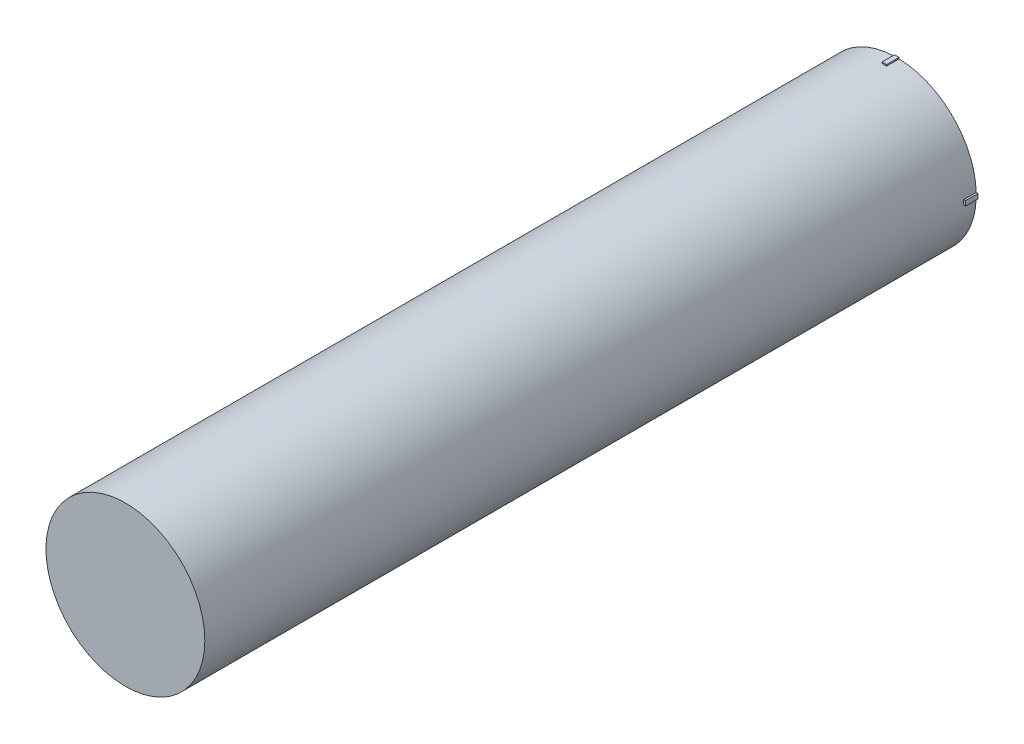
ISO-10303-21;
HEADER;
FILE_DESCRIPTION(('STEP AP214'),'2;1');
FILE_NAME('part.step','',(''),(''),'','','');
FILE_SCHEMA(('AUTOMOTIVE_DESIGN { 1 0 10303 214 1 1 1 1 }'));
ENDSEC;
DATA;
#1=APPLICATION_CONTEXT('core data for automotive mechanical design processes');
#2=APPLICATION_PROTOCOL_DEFINITION('international standard','automotive_design',2000,#1);
#3=PRODUCT_CONTEXT('',#1,'mechanical');
#4=PRODUCT('Part','Part','',(#3));
#5=PRODUCT_RELATED_PRODUCT_CATEGORY('part','',(#4));
#6=PRODUCT_DEFINITION_FORMATION('','',#4);
#7=PRODUCT_DEFINITION_CONTEXT('part definition',#1,'design');
#8=PRODUCT_DEFINITION('design','',#6,#7);
#9=PRODUCT_DEFINITION_SHAPE('','',#8);
#10=(LENGTH_UNIT() NAMED_UNIT(*) SI_UNIT(.MILLI.,.METRE.));
#11=(NAMED_UNIT(*) PLANE_ANGLE_UNIT() SI_UNIT($,.RADIAN.));
#12=(NAMED_UNIT(*) SI_UNIT($,.STERADIAN.) SOLID_ANGLE_UNIT());
#13=UNCERTAINTY_MEASURE_WITH_UNIT(LENGTH_MEASURE(1.E-05),#10,'distance_accuracy_value','');
#14=(GEOMETRIC_REPRESENTATION_CONTEXT(3) GLOBAL_UNCERTAINTY_ASSIGNED_CONTEXT((#13)) GLOBAL_UNIT_ASSIGNED_CONTEXT((#10,
#11,#12)) REPRESENTATION_CONTEXT('',''));
#15=CARTESIAN_POINT('',(0.,0.,0.));
#16=DIRECTION('',(0.,0.,1.));
#17=DIRECTION('',(1.,0.,0.));
#18=AXIS2_PLACEMENT_3D('',#15,#16,#17);
#19=CARTESIAN_POINT('',(0.,0.,185.));
#20=DIRECTION('',(0.,0.,-1.));
#21=DIRECTION('',(-1.,0.,0.));
#22=AXIS2_PLACEMENT_3D('',#19,#20,#21);
#23=CYLINDRICAL_SURFACE('',#22,19.05);
#24=CARTESIAN_POINT('',(0.,0.,0.));
#25=DIRECTION('',(0.,0.,1.));
#26=DIRECTION('',(1.,0.,0.));
#27=AXIS2_PLACEMENT_3D('',#24,#25,#26);
#28=CIRCLE('',#27,19.05);
#29=CARTESIAN_POINT('',(-19.0416827581294,-0.562865648940678,0.));
#30=VERTEX_POINT('',#29);
#31=CARTESIAN_POINT('',(-0.545809114124121,-19.0421792978361,0.));
#32=VERTEX_POINT('',#31);
#33=EDGE_CURVE('E262',#30,#32,#28,.T.);
#34=ORIENTED_EDGE('',*,*,#33,.T.);
#35=DIRECTION('',(0.,0.,-1.));
#36=VECTOR('',#35,1.);
#37=CARTESIAN_POINT('',(-0.545809114124121,-19.0421792978361,185.));
#38=LINE('',#37,#36);
#39=CARTESIAN_POINT('',(-0.545809114124121,-19.0421792978361,3.));
#40=VERTEX_POINT('',#39);
#41=EDGE_CURVE('E50',#32,#40,#38,.F.);
#42=ORIENTED_EDGE('',*,*,#41,.T.);
#43=CARTESIAN_POINT('',(0.,0.,3.));
#44=DIRECTION('',(0.,0.,1.));
#45=DIRECTION('',(1.,0.,0.));
#46=AXIS2_PLACEMENT_3D('',#43,#44,#45);
#47=CIRCLE('',#46,19.05);
#48=CARTESIAN_POINT('',(0.545809114124121,-19.0421792978361,3.));
#49=VERTEX_POINT('',#48);
#50=EDGE_CURVE('E11',#40,#49,#47,.T.);
#51=ORIENTED_EDGE('',*,*,#50,.T.);
#52=DIRECTION('',(0.,0.,-1.));
#53=VECTOR('',#52,1.);
#54=CARTESIAN_POINT('',(0.545809114124121,-19.0421792978361,185.));
#55=LINE('',#54,#53);
#56=CARTESIAN_POINT('',(0.545809114124121,-19.0421792978361,0.));
#57=VERTEX_POINT('',#56);
#58=EDGE_CURVE('E148',#49,#57,#55,.T.);
#59=ORIENTED_EDGE('',*,*,#58,.T.);
#60=CARTESIAN_POINT('',(19.0416827581294,-0.562865648940678,0.));
#61=VERTEX_POINT('',#60);
#62=EDGE_CURVE('E254',#57,#61,#28,.T.);
#63=ORIENTED_EDGE('',*,*,#62,.T.);
#64=DIRECTION('',(0.,0.,-1.));
#65=VECTOR('',#64,1.);
#66=CARTESIAN_POINT('',(19.0416827581294,-0.562865648940678,185.));
#67=LINE('',#66,#65);
#68=CARTESIAN_POINT('',(19.0416827581294,-0.562865648940678,3.));
#69=VERTEX_POINT('',#68);
#70=EDGE_CURVE('E252',#61,#69,#67,.F.);
#71=ORIENTED_EDGE('',*,*,#70,.T.);
#72=CARTESIAN_POINT('',(0.,0.,3.));
#73=DIRECTION('',(0.,0.,1.));
#74=DIRECTION('',(1.,0.,0.));
#75=AXIS2_PLACEMENT_3D('',#72,#73,#74);
#76=CIRCLE('',#75,19.05);
#77=CARTESIAN_POINT('',(19.0416827581294,0.562865648940678,3.));
#78=VERTEX_POINT('',#77);
#79=EDGE_CURVE('E258',#69,#78,#76,.T.);
#80=ORIENTED_EDGE('',*,*,#79,.T.);
#81=DIRECTION('',(0.,0.,-1.));
#82=VECTOR('',#81,1.);
#83=CARTESIAN_POINT('',(19.0416827581294,0.562865648940678,185.));
#84=LINE('',#83,#82);
#85=CARTESIAN_POINT('',(19.0416827581294,0.562865648940678,0.));
#86=VERTEX_POINT('',#85);
#87=EDGE_CURVE('E247',#78,#86,#84,.T.);
#88=ORIENTED_EDGE('',*,*,#87,.T.);
#89=CARTESIAN_POINT('',(0.545809114124121,19.0421792978361,0.));
#90=VERTEX_POINT('',#89);
#91=EDGE_CURVE('E259',#86,#90,#28,.T.);
#92=ORIENTED_EDGE('',*,*,#91,.T.);
#93=DIRECTION('',(0.,0.,-1.));
#94=VECTOR('',#93,1.);
#95=CARTESIAN_POINT('',(0.545809114124121,19.0421792978361,185.));
#96=LINE('',#95,#94);
#97=CARTESIAN_POINT('',(0.545809114124121,19.0421792978361,3.));
#98=VERTEX_POINT('',#97);
#99=EDGE_CURVE('E195',#90,#98,#96,.F.);
#100=ORIENTED_EDGE('',*,*,#99,.T.);
#101=CARTESIAN_POINT('',(0.,0.,3.));
#102=DIRECTION('',(0.,0.,1.));
#103=DIRECTION('',(1.,0.,0.));
#104=AXIS2_PLACEMENT_3D('',#101,#102,#103);
#105=CIRCLE('',#104,19.05);
#106=CARTESIAN_POINT('',(-0.545809114124121,19.0421792978361,3.));
#107=VERTEX_POINT('',#106);
#108=EDGE_CURVE('E40',#98,#107,#105,.T.);
#109=ORIENTED_EDGE('',*,*,#108,.T.);
#110=DIRECTION('',(0.,0.,-1.));
#111=VECTOR('',#110,1.);
#112=CARTESIAN_POINT('',(-0.545809114124121,19.0421792978361,185.));
#113=LINE('',#112,#111);
#114=CARTESIAN_POINT('',(-0.545809114124121,19.0421792978361,0.));
#115=VERTEX_POINT('',#114);
#116=EDGE_CURVE('E199',#107,#115,#113,.T.);
#117=ORIENTED_EDGE('',*,*,#116,.T.);
#118=CARTESIAN_POINT('',(-19.0416827581294,0.562865648940678,0.));
#119=VERTEX_POINT('',#118);
#120=EDGE_CURVE('E261',#115,#119,#28,.T.);
#121=ORIENTED_EDGE('',*,*,#120,.T.);
#122=DIRECTION('',(0.,0.,-1.));
#123=VECTOR('',#122,1.);
#124=CARTESIAN_POINT('',(-19.0416827581294,0.562865648940678,185.));
#125=LINE('',#124,#123);
#126=CARTESIAN_POINT('',(-19.0416827581294,0.562865648940678,3.));
#127=VERTEX_POINT('',#126);
#128=EDGE_CURVE('E226',#119,#127,#125,.F.);
#129=ORIENTED_EDGE('',*,*,#128,.T.);
#130=CARTESIAN_POINT('',(0.,0.,3.));
#131=DIRECTION('',(0.,0.,-1.));
#132=DIRECTION('',(-1.,0.,0.));
#133=AXIS2_PLACEMENT_3D('',#130,#131,#132);
#134=CIRCLE('',#133,19.05);
#135=CARTESIAN_POINT('',(-19.0416827581294,-0.562865648940677,3.));
#136=VERTEX_POINT('',#135);
#137=EDGE_CURVE('E264',#136,#127,#134,.T.);
#138=ORIENTED_EDGE('',*,*,#137,.F.);
#139=DIRECTION('',(0.,0.,-1.));
#140=VECTOR('',#139,1.);
#141=CARTESIAN_POINT('',(-19.0416827581294,-0.562865648940677,185.));
#142=LINE('',#141,#140);
#143=EDGE_CURVE('E221',#136,#30,#142,.T.);
#144=ORIENTED_EDGE('',*,*,#143,.T.);
#145=EDGE_LOOP('',(#34,#42,#51,#59,#63,#71,#80,#88,#92,#100,#109,#117,#121,#129,#138,#144));
#146=FACE_BOUND('',#145,.T.);
#147=CARTESIAN_POINT('',(0.,0.,185.));
#148=DIRECTION('',(0.,0.,1.));
#149=DIRECTION('',(1.,0.,0.));
#150=AXIS2_PLACEMENT_3D('',#147,#148,#149);
#151=CIRCLE('',#150,19.05);
#152=CARTESIAN_POINT('',(19.05,0.,185.));
#153=VERTEX_POINT('',#152);
#154=EDGE_CURVE('E255',#153,#153,#151,.T.);
#155=ORIENTED_EDGE('',*,*,#154,.F.);
#156=EDGE_LOOP('',(#155));
#157=FACE_BOUND('',#156,.T.);
#158=ADVANCED_FACE('F33',(#146,#157),#23,.T.);
#159=CARTESIAN_POINT('',(0.,0.,185.));
#160=DIRECTION('',(0.,0.,1.));
#161=DIRECTION('',(1.,0.,0.));
#162=AXIS2_PLACEMENT_3D('',#159,#160,#161);
#163=PLANE('',#162);
#164=ORIENTED_EDGE('',*,*,#154,.T.);
#165=EDGE_LOOP('',(#164));
#166=FACE_BOUND('',#165,.T.);
#167=ADVANCED_FACE('F315',(#166),#163,.T.);
#168=CARTESIAN_POINT('',(0.,0.,0.));
#169=DIRECTION('',(0.,0.,1.));
#170=DIRECTION('',(1.,0.,0.));
#171=AXIS2_PLACEMENT_3D('',#168,#169,#170);
#172=PLANE('',#171);
#173=ORIENTED_EDGE('',*,*,#62,.F.);
#174=DIRECTION('',(0.,-1.,0.));
#175=VECTOR('',#174,1.);
#176=CARTESIAN_POINT('',(0.545809114124121,-19.3840122581255,0.));
#177=LINE('',#176,#175);
#178=CARTESIAN_POINT('',(0.545809114124121,-19.3840122581255,0.));
#179=VERTEX_POINT('',#178);
#180=EDGE_CURVE('E170',#57,#179,#177,.T.);
#181=ORIENTED_EDGE('',*,*,#180,.T.);
#182=DIRECTION('',(-1.,0.,0.));
#183=VECTOR('',#182,1.);
#184=CARTESIAN_POINT('',(0.545809114124121,-19.3840122581255,0.));
#185=LINE('',#184,#183);
#186=CARTESIAN_POINT('',(-0.545809114124121,-19.3840122581255,0.));
#187=VERTEX_POINT('',#186);
#188=EDGE_CURVE('E158',#179,#187,#185,.T.);
#189=ORIENTED_EDGE('',*,*,#188,.T.);
#190=DIRECTION('',(0.,1.,0.));
#191=VECTOR('',#190,1.);
#192=CARTESIAN_POINT('',(-0.545809114124121,-19.3840122581255,0.));
#193=LINE('',#192,#191);
#194=EDGE_CURVE('E167',#187,#32,#193,.T.);
#195=ORIENTED_EDGE('',*,*,#194,.T.);
#196=ORIENTED_EDGE('',*,*,#33,.F.);
#197=DIRECTION('',(-1.,0.,0.));
#198=VECTOR('',#197,1.);
#199=CARTESIAN_POINT('',(-19.4351818625744,-0.562865648940677,0.));
#200=LINE('',#199,#198);
#201=CARTESIAN_POINT('',(-19.4351818625744,-0.562865648940677,0.));
#202=VERTEX_POINT('',#201);
#203=EDGE_CURVE('E202',#30,#202,#200,.T.);
#204=ORIENTED_EDGE('',*,*,#203,.T.);
#205=DIRECTION('',(0.,1.,0.));
#206=VECTOR('',#205,1.);
#207=CARTESIAN_POINT('',(-19.4351818625744,-0.562865648940677,0.));
#208=LINE('',#207,#206);
#209=CARTESIAN_POINT('',(-19.4351818625744,0.562865648940678,0.));
#210=VERTEX_POINT('',#209);
#211=EDGE_CURVE('E214',#202,#210,#208,.T.);
#212=ORIENTED_EDGE('',*,*,#211,.T.);
#213=DIRECTION('',(1.,0.,0.));
#214=VECTOR('',#213,1.);
#215=CARTESIAN_POINT('',(-19.4351818625744,0.562865648940678,0.));
#216=LINE('',#215,#214);
#217=EDGE_CURVE('E206',#210,#119,#216,.T.);
#218=ORIENTED_EDGE('',*,*,#217,.T.);
#219=ORIENTED_EDGE('',*,*,#120,.F.);
#220=DIRECTION('',(0.,1.,0.));
#221=VECTOR('',#220,1.);
#222=CARTESIAN_POINT('',(-0.545809114124121,18.7358639351027,0.));
#223=LINE('',#222,#221);
#224=CARTESIAN_POINT('',(-0.545809114124121,19.3641360648973,0.));
#225=VERTEX_POINT('',#224);
#226=EDGE_CURVE('E176',#115,#225,#223,.T.);
#227=ORIENTED_EDGE('',*,*,#226,.T.);
#228=DIRECTION('',(1.,0.,0.));
#229=VECTOR('',#228,1.);
#230=CARTESIAN_POINT('',(0.545809114124121,19.3641360648973,0.));
#231=LINE('',#230,#229);
#232=CARTESIAN_POINT('',(0.545809114124121,19.3641360648973,0.));
#233=VERTEX_POINT('',#232);
#234=EDGE_CURVE('E188',#225,#233,#231,.T.);
#235=ORIENTED_EDGE('',*,*,#234,.T.);
#236=DIRECTION('',(0.,-1.,0.));
#237=VECTOR('',#236,1.);
#238=CARTESIAN_POINT('',(0.545809114124121,18.7358639351027,0.));
#239=LINE('',#238,#237);
#240=EDGE_CURVE('E180',#233,#90,#239,.T.);
#241=ORIENTED_EDGE('',*,*,#240,.T.);
#242=ORIENTED_EDGE('',*,*,#91,.F.);
#243=DIRECTION('',(1.,0.,0.));
#244=VECTOR('',#243,1.);
#245=CARTESIAN_POINT('',(19.4692949322072,0.562865648940678,0.));
#246=LINE('',#245,#244);
#247=CARTESIAN_POINT('',(19.4692949322072,0.562865648940678,0.));
#248=VERTEX_POINT('',#247);
#249=EDGE_CURVE('E228',#86,#248,#246,.T.);
#250=ORIENTED_EDGE('',*,*,#249,.T.);
#251=DIRECTION('',(0.,-1.,0.));
#252=VECTOR('',#251,1.);
#253=CARTESIAN_POINT('',(19.4692949322072,-0.562865648940678,0.));
#254=LINE('',#253,#252);
#255=CARTESIAN_POINT('',(19.4692949322072,-0.562865648940678,0.));
#256=VERTEX_POINT('',#255);
#257=EDGE_CURVE('E240',#248,#256,#254,.T.);
#258=ORIENTED_EDGE('',*,*,#257,.T.);
#259=DIRECTION('',(-1.,0.,0.));
#260=VECTOR('',#259,1.);
#261=CARTESIAN_POINT('',(19.4692949322072,-0.562865648940678,0.));
#262=LINE('',#261,#260);
#263=EDGE_CURVE('E232',#256,#61,#262,.T.);
#264=ORIENTED_EDGE('',*,*,#263,.T.);
#265=EDGE_LOOP('',(#173,#181,#189,#195,#196,#204,#212,#218,#219,#227,#235,#241,#242,#250,#258,#264));
#266=FACE_BOUND('',#265,.T.);
#267=ADVANCED_FACE('F284',(#266),#172,.F.);
#268=CARTESIAN_POINT('',(19.4692949322072,-0.562865648940678,3.));
#269=DIRECTION('',(0.,-1.,0.));
#270=DIRECTION('',(0.,0.,-1.));
#271=AXIS2_PLACEMENT_3D('',#268,#269,#270);
#272=PLANE('',#271);
#273=ORIENTED_EDGE('',*,*,#70,.F.);
#274=ORIENTED_EDGE('',*,*,#263,.F.);
#275=DIRECTION('',(0.,0.,-1.));
#276=VECTOR('',#275,1.);
#277=CARTESIAN_POINT('',(19.4692949322072,-0.562865648940678,3.));
#278=LINE('',#277,#276);
#279=CARTESIAN_POINT('',(19.4692949322072,-0.562865648940678,3.));
#280=VERTEX_POINT('',#279);
#281=EDGE_CURVE('E245',#280,#256,#278,.T.);
#282=ORIENTED_EDGE('',*,*,#281,.F.);
#283=DIRECTION('',(-1.,0.,0.));
#284=VECTOR('',#283,1.);
#285=CARTESIAN_POINT('',(19.4692949322072,-0.562865648940678,3.));
#286=LINE('',#285,#284);
#287=EDGE_CURVE('E235',#280,#69,#286,.T.);
#288=ORIENTED_EDGE('',*,*,#287,.T.);
#289=EDGE_LOOP('',(#273,#274,#282,#288));
#290=FACE_BOUND('',#289,.T.);
#291=ADVANCED_FACE('F291',(#290),#272,.T.);
#292=CARTESIAN_POINT('',(19.4692949322072,0.562865648940678,3.));
#293=DIRECTION('',(0.,1.,0.));
#294=DIRECTION('',(0.,0.,1.));
#295=AXIS2_PLACEMENT_3D('',#292,#293,#294);
#296=PLANE('',#295);
#297=ORIENTED_EDGE('',*,*,#87,.F.);
#298=DIRECTION('',(1.,0.,0.));
#299=VECTOR('',#298,1.);
#300=CARTESIAN_POINT('',(19.4692949322072,0.562865648940678,3.));
#301=LINE('',#300,#299);
#302=CARTESIAN_POINT('',(19.4692949322072,0.562865648940678,3.));
#303=VERTEX_POINT('',#302);
#304=EDGE_CURVE('E229',#78,#303,#301,.T.);
#305=ORIENTED_EDGE('',*,*,#304,.T.);
#306=DIRECTION('',(0.,0.,-1.));
#307=VECTOR('',#306,1.);
#308=CARTESIAN_POINT('',(19.4692949322072,0.562865648940678,3.));
#309=LINE('',#308,#307);
#310=EDGE_CURVE('E238',#303,#248,#309,.T.);
#311=ORIENTED_EDGE('',*,*,#310,.T.);
#312=ORIENTED_EDGE('',*,*,#249,.F.);
#313=EDGE_LOOP('',(#297,#305,#311,#312));
#314=FACE_BOUND('',#313,.T.);
#315=ADVANCED_FACE('F304',(#314),#296,.T.);
#316=CARTESIAN_POINT('',(19.4692949322072,-0.562865648940678,3.));
#317=DIRECTION('',(1.,0.,0.));
#318=DIRECTION('',(0.,0.,-1.));
#319=AXIS2_PLACEMENT_3D('',#316,#317,#318);
#320=PLANE('',#319);
#321=ORIENTED_EDGE('',*,*,#257,.F.);
#322=ORIENTED_EDGE('',*,*,#310,.F.);
#323=DIRECTION('',(0.,-1.,0.));
#324=VECTOR('',#323,1.);
#325=CARTESIAN_POINT('',(19.4692949322072,-0.562865648940678,3.));
#326=LINE('',#325,#324);
#327=EDGE_CURVE('E231',#303,#280,#326,.T.);
#328=ORIENTED_EDGE('',*,*,#327,.T.);
#329=ORIENTED_EDGE('',*,*,#281,.T.);
#330=EDGE_LOOP('',(#321,#322,#328,#329));
#331=FACE_BOUND('',#330,.T.);
#332=ADVANCED_FACE('F297',(#331),#320,.T.);
#333=CARTESIAN_POINT('',(0.,0.,3.));
#334=DIRECTION('',(0.,0.,1.));
#335=DIRECTION('',(1.,0.,0.));
#336=AXIS2_PLACEMENT_3D('',#333,#334,#335);
#337=PLANE('',#336);
#338=ORIENTED_EDGE('',*,*,#79,.F.);
#339=ORIENTED_EDGE('',*,*,#287,.F.);
#340=ORIENTED_EDGE('',*,*,#327,.F.);
#341=ORIENTED_EDGE('',*,*,#304,.F.);
#342=EDGE_LOOP('',(#338,#339,#340,#341));
#343=FACE_BOUND('',#342,.T.);
#344=ADVANCED_FACE('F301',(#343),#337,.T.);
#345=CARTESIAN_POINT('',(-19.4351818625744,0.562865648940678,3.));
#346=DIRECTION('',(0.,1.,0.));
#347=DIRECTION('',(-1.,0.,0.));
#348=AXIS2_PLACEMENT_3D('',#345,#346,#347);
#349=PLANE('',#348);
#350=ORIENTED_EDGE('',*,*,#128,.F.);
#351=ORIENTED_EDGE('',*,*,#217,.F.);
#352=DIRECTION('',(0.,0.,-1.));
#353=VECTOR('',#352,1.);
#354=CARTESIAN_POINT('',(-19.4351818625744,0.562865648940678,3.));
#355=LINE('',#354,#353);
#356=CARTESIAN_POINT('',(-19.4351818625744,0.562865648940678,3.));
#357=VERTEX_POINT('',#356);
#358=EDGE_CURVE('E219',#357,#210,#355,.T.);
#359=ORIENTED_EDGE('',*,*,#358,.F.);
#360=DIRECTION('',(1.,0.,0.));
#361=VECTOR('',#360,1.);
#362=CARTESIAN_POINT('',(-19.4351818625744,0.562865648940678,3.));
#363=LINE('',#362,#361);
#364=EDGE_CURVE('E209',#357,#127,#363,.T.);
#365=ORIENTED_EDGE('',*,*,#364,.T.);
#366=EDGE_LOOP('',(#350,#351,#359,#365));
#367=FACE_BOUND('',#366,.T.);
#368=ADVANCED_FACE('F349',(#367),#349,.T.);
#369=CARTESIAN_POINT('',(-19.4351818625744,-0.562865648940677,3.));
#370=DIRECTION('',(0.,-1.,0.));
#371=DIRECTION('',(1.,0.,0.));
#372=AXIS2_PLACEMENT_3D('',#369,#370,#371);
#373=PLANE('',#372);
#374=ORIENTED_EDGE('',*,*,#143,.F.);
#375=DIRECTION('',(-1.,0.,0.));
#376=VECTOR('',#375,1.);
#377=CARTESIAN_POINT('',(-19.4351818625744,-0.562865648940677,3.));
#378=LINE('',#377,#376);
#379=CARTESIAN_POINT('',(-19.4351818625744,-0.562865648940677,3.));
#380=VERTEX_POINT('',#379);
#381=EDGE_CURVE('E203',#136,#380,#378,.T.);
#382=ORIENTED_EDGE('',*,*,#381,.T.);
#383=DIRECTION('',(0.,0.,-1.));
#384=VECTOR('',#383,1.);
#385=CARTESIAN_POINT('',(-19.4351818625744,-0.562865648940677,3.));
#386=LINE('',#385,#384);
#387=EDGE_CURVE('E212',#380,#202,#386,.T.);
#388=ORIENTED_EDGE('',*,*,#387,.T.);
#389=ORIENTED_EDGE('',*,*,#203,.F.);
#390=EDGE_LOOP('',(#374,#382,#388,#389));
#391=FACE_BOUND('',#390,.T.);
#392=ADVANCED_FACE('F358',(#391),#373,.T.);
#393=CARTESIAN_POINT('',(-19.4351818625744,-0.562865648940677,3.));
#394=DIRECTION('',(-1.,0.,0.));
#395=DIRECTION('',(0.,0.,1.));
#396=AXIS2_PLACEMENT_3D('',#393,#394,#395);
#397=PLANE('',#396);
#398=ORIENTED_EDGE('',*,*,#211,.F.);
#399=ORIENTED_EDGE('',*,*,#387,.F.);
#400=DIRECTION('',(0.,1.,0.));
#401=VECTOR('',#400,1.);
#402=CARTESIAN_POINT('',(-19.4351818625744,-0.562865648940677,3.));
#403=LINE('',#402,#401);
#404=EDGE_CURVE('E205',#380,#357,#403,.T.);
#405=ORIENTED_EDGE('',*,*,#404,.T.);
#406=ORIENTED_EDGE('',*,*,#358,.T.);
#407=EDGE_LOOP('',(#398,#399,#405,#406));
#408=FACE_BOUND('',#407,.T.);
#409=ADVANCED_FACE('F368',(#408),#397,.T.);
#410=CARTESIAN_POINT('',(0.,0.,3.));
#411=DIRECTION('',(0.,0.,-1.));
#412=DIRECTION('',(-1.,0.,0.));
#413=AXIS2_PLACEMENT_3D('',#410,#411,#412);
#414=PLANE('',#413);
#415=ORIENTED_EDGE('',*,*,#381,.F.);
#416=ORIENTED_EDGE('',*,*,#137,.T.);
#417=ORIENTED_EDGE('',*,*,#364,.F.);
#418=ORIENTED_EDGE('',*,*,#404,.F.);
#419=EDGE_LOOP('',(#415,#416,#417,#418));
#420=FACE_BOUND('',#419,.T.);
#421=ADVANCED_FACE('F378',(#420),#414,.F.);
#422=CARTESIAN_POINT('',(-0.545809114124121,18.7358639351027,3.));
#423=DIRECTION('',(-1.,0.,0.));
#424=DIRECTION('',(0.,0.,1.));
#425=AXIS2_PLACEMENT_3D('',#422,#423,#424);
#426=PLANE('',#425);
#427=ORIENTED_EDGE('',*,*,#116,.F.);
#428=DIRECTION('',(0.,1.,0.));
#429=VECTOR('',#428,1.);
#430=CARTESIAN_POINT('',(-0.545809114124121,18.7358639351027,3.));
#431=LINE('',#430,#429);
#432=CARTESIAN_POINT('',(-0.545809114124121,19.3641360648973,3.));
#433=VERTEX_POINT('',#432);
#434=EDGE_CURVE('E177',#107,#433,#431,.T.);
#435=ORIENTED_EDGE('',*,*,#434,.T.);
#436=DIRECTION('',(0.,0.,-1.));
#437=VECTOR('',#436,1.);
#438=CARTESIAN_POINT('',(-0.545809114124121,19.3641360648973,3.));
#439=LINE('',#438,#437);
#440=EDGE_CURVE('E186',#433,#225,#439,.T.);
#441=ORIENTED_EDGE('',*,*,#440,.T.);
#442=ORIENTED_EDGE('',*,*,#226,.F.);
#443=EDGE_LOOP('',(#427,#435,#441,#442));
#444=FACE_BOUND('',#443,.T.);
#445=ADVANCED_FACE('F275',(#444),#426,.T.);
#446=CARTESIAN_POINT('',(0.545809114124121,18.7358639351027,3.));
#447=DIRECTION('',(1.,0.,0.));
#448=DIRECTION('',(0.,0.,-1.));
#449=AXIS2_PLACEMENT_3D('',#446,#447,#448);
#450=PLANE('',#449);
#451=ORIENTED_EDGE('',*,*,#99,.F.);
#452=ORIENTED_EDGE('',*,*,#240,.F.);
#453=DIRECTION('',(0.,0.,-1.));
#454=VECTOR('',#453,1.);
#455=CARTESIAN_POINT('',(0.545809114124121,19.3641360648973,3.));
#456=LINE('',#455,#454);
#457=CARTESIAN_POINT('',(0.545809114124121,19.3641360648973,3.));
#458=VERTEX_POINT('',#457);
#459=EDGE_CURVE('E193',#458,#233,#456,.T.);
#460=ORIENTED_EDGE('',*,*,#459,.F.);
#461=DIRECTION('',(0.,-1.,0.));
#462=VECTOR('',#461,1.);
#463=CARTESIAN_POINT('',(0.545809114124121,18.7358639351027,3.));
#464=LINE('',#463,#462);
#465=EDGE_CURVE('E183',#458,#98,#464,.T.);
#466=ORIENTED_EDGE('',*,*,#465,.T.);
#467=EDGE_LOOP('',(#451,#452,#460,#466));
#468=FACE_BOUND('',#467,.T.);
#469=ADVANCED_FACE('F397',(#468),#450,.T.);
#470=CARTESIAN_POINT('',(0.545809114124121,19.3641360648973,3.));
#471=DIRECTION('',(0.,1.,0.));
#472=DIRECTION('',(0.,0.,1.));
#473=AXIS2_PLACEMENT_3D('',#470,#471,#472);
#474=PLANE('',#473);
#475=ORIENTED_EDGE('',*,*,#234,.F.);
#476=ORIENTED_EDGE('',*,*,#440,.F.);
#477=DIRECTION('',(1.,0.,0.));
#478=VECTOR('',#477,1.);
#479=CARTESIAN_POINT('',(0.545809114124121,19.3641360648973,3.));
#480=LINE('',#479,#478);
#481=EDGE_CURVE('E179',#433,#458,#480,.T.);
#482=ORIENTED_EDGE('',*,*,#481,.T.);
#483=ORIENTED_EDGE('',*,*,#459,.T.);
#484=EDGE_LOOP('',(#475,#476,#482,#483));
#485=FACE_BOUND('',#484,.T.);
#486=ADVANCED_FACE('F281',(#485),#474,.T.);
#487=CARTESIAN_POINT('',(0.,0.,3.));
#488=DIRECTION('',(0.,0.,1.));
#489=DIRECTION('',(1.,0.,0.));
#490=AXIS2_PLACEMENT_3D('',#487,#488,#489);
#491=PLANE('',#490);
#492=ORIENTED_EDGE('',*,*,#108,.F.);
#493=ORIENTED_EDGE('',*,*,#465,.F.);
#494=ORIENTED_EDGE('',*,*,#481,.F.);
#495=ORIENTED_EDGE('',*,*,#434,.F.);
#496=EDGE_LOOP('',(#492,#493,#494,#495));
#497=FACE_BOUND('',#496,.T.);
#498=ADVANCED_FACE('F278',(#497),#491,.T.);
#499=CARTESIAN_POINT('',(-0.545809114124121,-19.3840122581255,3.));
#500=DIRECTION('',(-1.,0.,0.));
#501=DIRECTION('',(0.,0.,1.));
#502=AXIS2_PLACEMENT_3D('',#499,#500,#501);
#503=PLANE('',#502);
#504=ORIENTED_EDGE('',*,*,#41,.F.);
#505=ORIENTED_EDGE('',*,*,#194,.F.);
#506=DIRECTION('',(0.,0.,-1.));
#507=VECTOR('',#506,1.);
#508=CARTESIAN_POINT('',(-0.545809114124121,-19.3840122581255,3.));
#509=LINE('',#508,#507);
#510=CARTESIAN_POINT('',(-0.545809114124121,-19.3840122581255,3.));
#511=VERTEX_POINT('',#510);
#512=EDGE_CURVE('E159',#511,#187,#509,.T.);
#513=ORIENTED_EDGE('',*,*,#512,.F.);
#514=DIRECTION('',(0.,1.,0.));
#515=VECTOR('',#514,1.);
#516=CARTESIAN_POINT('',(-0.545809114124121,-19.3840122581255,3.));
#517=LINE('',#516,#515);
#518=EDGE_CURVE('E152',#511,#40,#517,.T.);
#519=ORIENTED_EDGE('',*,*,#518,.T.);
#520=EDGE_LOOP('',(#504,#505,#513,#519));
#521=FACE_BOUND('',#520,.T.);
#522=ADVANCED_FACE('F423',(#521),#503,.T.);
#523=CARTESIAN_POINT('',(0.545809114124121,-19.3840122581255,3.));
#524=DIRECTION('',(1.,0.,0.));
#525=DIRECTION('',(0.,0.,-1.));
#526=AXIS2_PLACEMENT_3D('',#523,#524,#525);
#527=PLANE('',#526);
#528=ORIENTED_EDGE('',*,*,#58,.F.);
#529=DIRECTION('',(0.,-1.,0.));
#530=VECTOR('',#529,1.);
#531=CARTESIAN_POINT('',(0.545809114124121,-19.3840122581255,3.));
#532=LINE('',#531,#530);
#533=CARTESIAN_POINT('',(0.545809114124121,-19.3840122581255,3.));
#534=VERTEX_POINT('',#533);
#535=EDGE_CURVE('E142',#49,#534,#532,.T.);
#536=ORIENTED_EDGE('',*,*,#535,.T.);
#537=DIRECTION('',(0.,0.,-1.));
#538=VECTOR('',#537,1.);
#539=CARTESIAN_POINT('',(0.545809114124121,-19.3840122581255,3.));
#540=LINE('',#539,#538);
#541=EDGE_CURVE('E146',#534,#179,#540,.T.);
#542=ORIENTED_EDGE('',*,*,#541,.T.);
#543=ORIENTED_EDGE('',*,*,#180,.F.);
#544=EDGE_LOOP('',(#528,#536,#542,#543));
#545=FACE_BOUND('',#544,.T.);
#546=ADVANCED_FACE('F144',(#545),#527,.T.);
#547=CARTESIAN_POINT('',(0.545809114124121,-19.3840122581255,3.));
#548=DIRECTION('',(0.,-1.,0.));
#549=DIRECTION('',(0.,0.,-1.));
#550=AXIS2_PLACEMENT_3D('',#547,#548,#549);
#551=PLANE('',#550);
#552=ORIENTED_EDGE('',*,*,#188,.F.);
#553=ORIENTED_EDGE('',*,*,#541,.F.);
#554=DIRECTION('',(-1.,0.,0.));
#555=VECTOR('',#554,1.);
#556=CARTESIAN_POINT('',(0.545809114124121,-19.3840122581255,3.));
#557=LINE('',#556,#555);
#558=EDGE_CURVE('E151',#534,#511,#557,.T.);
#559=ORIENTED_EDGE('',*,*,#558,.T.);
#560=ORIENTED_EDGE('',*,*,#512,.T.);
#561=EDGE_LOOP('',(#552,#553,#559,#560));
#562=FACE_BOUND('',#561,.T.);
#563=ADVANCED_FACE('F156',(#562),#551,.T.);
#564=CARTESIAN_POINT('',(0.,0.,3.));
#565=DIRECTION('',(0.,0.,1.));
#566=DIRECTION('',(1.,0.,0.));
#567=AXIS2_PLACEMENT_3D('',#564,#565,#566);
#568=PLANE('',#567);
#569=ORIENTED_EDGE('',*,*,#50,.F.);
#570=ORIENTED_EDGE('',*,*,#518,.F.);
#571=ORIENTED_EDGE('',*,*,#558,.F.);
#572=ORIENTED_EDGE('',*,*,#535,.F.);
#573=EDGE_LOOP('',(#569,#570,#571,#572));
#574=FACE_BOUND('',#573,.T.);
#575=ADVANCED_FACE('F162',(#574),#568,.T.);
#576=CLOSED_SHELL('',(#158,#167,#267,#291,#315,#332,#344,#368,#392,#409,#421,#445,#469,#486,
#498,#522,#546,#563,#575));
#577=MANIFOLD_SOLID_BREP('B2',#576);
#578=ADVANCED_BREP_SHAPE_REPRESENTATION('',(#18,#577),#14);
#579=SHAPE_DEFINITION_REPRESENTATION(#9,#578);
ENDSEC;
END-ISO-10303-21;
